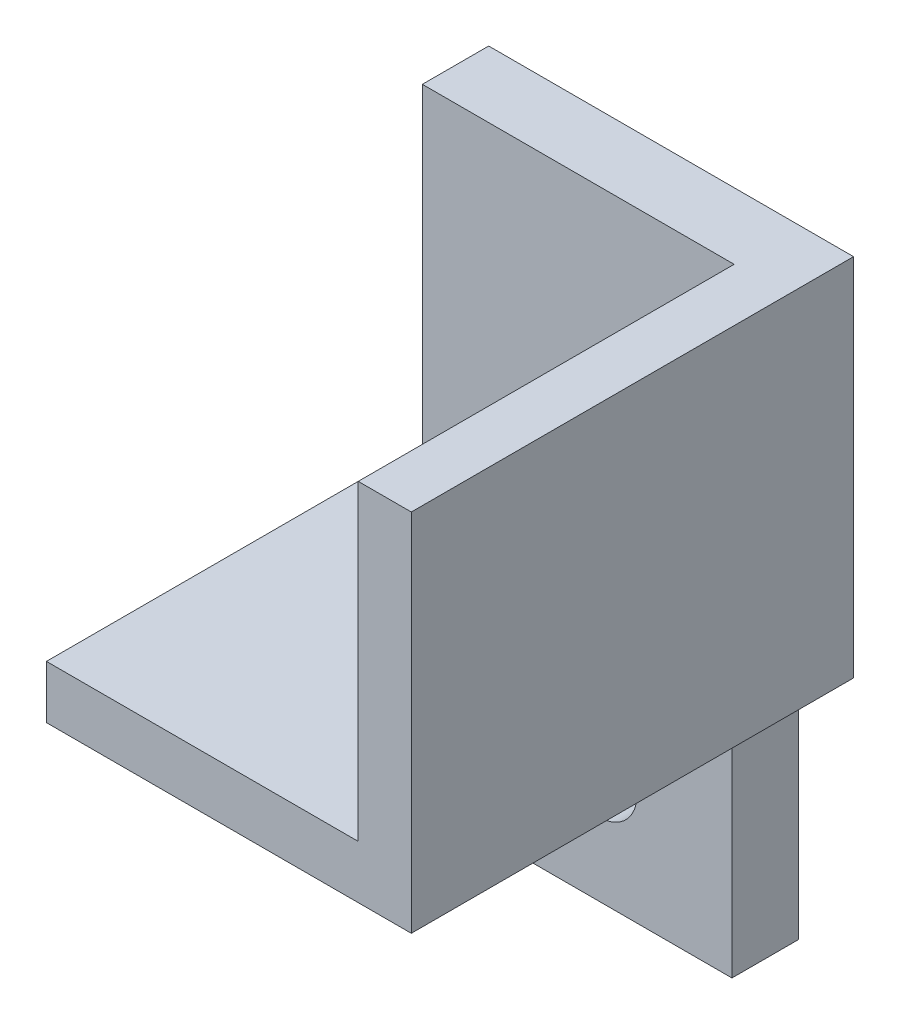
ISO-10303-21;
HEADER;
FILE_DESCRIPTION(('STEP AP214'),'2;1');
FILE_NAME('part.step','',(''),(''),'','','');
FILE_SCHEMA(('AUTOMOTIVE_DESIGN { 1 0 10303 214 1 1 1 1 }'));
ENDSEC;
DATA;
#1=APPLICATION_CONTEXT('core data for automotive mechanical design processes');
#2=APPLICATION_PROTOCOL_DEFINITION('international standard','automotive_design',2000,#1);
#3=PRODUCT_CONTEXT('',#1,'mechanical');
#4=PRODUCT('Part','Part','',(#3));
#5=PRODUCT_RELATED_PRODUCT_CATEGORY('part','',(#4));
#6=PRODUCT_DEFINITION_FORMATION('','',#4);
#7=PRODUCT_DEFINITION_CONTEXT('part definition',#1,'design');
#8=PRODUCT_DEFINITION('design','',#6,#7);
#9=PRODUCT_DEFINITION_SHAPE('','',#8);
#10=(LENGTH_UNIT() NAMED_UNIT(*) SI_UNIT(.MILLI.,.METRE.));
#11=(NAMED_UNIT(*) PLANE_ANGLE_UNIT() SI_UNIT($,.RADIAN.));
#12=(NAMED_UNIT(*) SI_UNIT($,.STERADIAN.) SOLID_ANGLE_UNIT());
#13=UNCERTAINTY_MEASURE_WITH_UNIT(LENGTH_MEASURE(1.E-05),#10,'distance_accuracy_value','');
#14=(GEOMETRIC_REPRESENTATION_CONTEXT(3) GLOBAL_UNCERTAINTY_ASSIGNED_CONTEXT((#13)) GLOBAL_UNIT_ASSIGNED_CONTEXT((#10,
#11,#12)) REPRESENTATION_CONTEXT('',''));
#15=CARTESIAN_POINT('',(0.,0.,0.));
#16=DIRECTION('',(0.,0.,1.));
#17=DIRECTION('',(1.,0.,0.));
#18=AXIS2_PLACEMENT_3D('',#15,#16,#17);
#19=CARTESIAN_POINT('',(-20.,-72.,181.4));
#20=DIRECTION('',(0.,0.,1.));
#21=DIRECTION('',(1.,0.,0.));
#22=AXIS2_PLACEMENT_3D('',#19,#20,#21);
#23=CYLINDRICAL_SURFACE('',#22,1.7);
#24=CARTESIAN_POINT('',(-20.,-72.,184.5));
#25=DIRECTION('',(0.,0.,-1.));
#26=DIRECTION('',(1.,0.,0.));
#27=AXIS2_PLACEMENT_3D('',#24,#25,#26);
#28=CIRCLE('',#27,1.7);
#29=CARTESIAN_POINT('',(-18.3,-72.,184.5));
#30=VERTEX_POINT('',#29);
#31=EDGE_CURVE('E172',#30,#30,#28,.T.);
#32=ORIENTED_EDGE('',*,*,#31,.F.);
#33=DIRECTION('',(0.,0.,1.));
#34=VECTOR('',#33,1.);
#35=CARTESIAN_POINT('',(-18.3,-72.,181.4));
#36=LINE('',#35,#34);
#37=CARTESIAN_POINT('',(-18.3,-72.,181.5));
#38=VERTEX_POINT('',#37);
#39=EDGE_CURVE('E10',#38,#30,#36,.T.);
#40=ORIENTED_EDGE('',*,*,#39,.F.);
#41=CARTESIAN_POINT('',(-20.,-72.,181.5));
#42=DIRECTION('',(0.,0.,-1.));
#43=DIRECTION('',(1.,0.,0.));
#44=AXIS2_PLACEMENT_3D('',#41,#42,#43);
#45=CIRCLE('',#44,1.7);
#46=EDGE_CURVE('E153',#38,#38,#45,.T.);
#47=ORIENTED_EDGE('',*,*,#46,.T.);
#48=ORIENTED_EDGE('',*,*,#39,.T.);
#49=EDGE_LOOP('',(#32,#40,#47,#48));
#50=FACE_BOUND('',#49,.T.);
#51=ADVANCED_FACE('F15',(#50),#23,.F.);
#52=CARTESIAN_POINT('',(-26.,-77.,181.5));
#53=DIRECTION('',(0.,-1.,0.));
#54=DIRECTION('',(0.,0.,-1.));
#55=AXIS2_PLACEMENT_3D('',#52,#53,#54);
#56=PLANE('',#55);
#57=DIRECTION('',(0.,0.,1.));
#58=VECTOR('',#57,1.);
#59=CARTESIAN_POINT('',(-14.,-77.,181.5));
#60=LINE('',#59,#58);
#61=CARTESIAN_POINT('',(-14.,-77.,181.5));
#62=VERTEX_POINT('',#61);
#63=CARTESIAN_POINT('',(-14.,-77.,184.5));
#64=VERTEX_POINT('',#63);
#65=EDGE_CURVE('E26',#62,#64,#60,.T.);
#66=ORIENTED_EDGE('',*,*,#65,.T.);
#67=DIRECTION('',(1.,0.,0.));
#68=VECTOR('',#67,1.);
#69=CARTESIAN_POINT('',(-26.,-77.,184.5));
#70=LINE('',#69,#68);
#71=CARTESIAN_POINT('',(-26.,-77.,184.5));
#72=VERTEX_POINT('',#71);
#73=EDGE_CURVE('E125',#72,#64,#70,.T.);
#74=ORIENTED_EDGE('',*,*,#73,.F.);
#75=DIRECTION('',(0.,0.,1.));
#76=VECTOR('',#75,1.);
#77=CARTESIAN_POINT('',(-26.,-77.,181.5));
#78=LINE('',#77,#76);
#79=CARTESIAN_POINT('',(-26.,-77.,181.5));
#80=VERTEX_POINT('',#79);
#81=EDGE_CURVE('E121',#80,#72,#78,.T.);
#82=ORIENTED_EDGE('',*,*,#81,.F.);
#83=DIRECTION('',(1.,0.,0.));
#84=VECTOR('',#83,1.);
#85=CARTESIAN_POINT('',(-26.,-77.,181.5));
#86=LINE('',#85,#84);
#87=EDGE_CURVE('E170',#80,#62,#86,.T.);
#88=ORIENTED_EDGE('',*,*,#87,.T.);
#89=EDGE_LOOP('',(#66,#74,#82,#88));
#90=FACE_BOUND('',#89,.T.);
#91=ADVANCED_FACE('F293',(#90),#56,.T.);
#92=CARTESIAN_POINT('',(-14.,-65.5,181.5));
#93=DIRECTION('',(1.,0.,0.));
#94=DIRECTION('',(0.,1.,0.));
#95=AXIS2_PLACEMENT_3D('',#92,#93,#94);
#96=PLANE('',#95);
#97=DIRECTION('',(0.,-1.,0.));
#98=VECTOR('',#97,1.);
#99=CARTESIAN_POINT('',(-14.,-65.5,184.5));
#100=LINE('',#99,#98);
#101=CARTESIAN_POINT('',(-14.,-65.5,184.5));
#102=VERTEX_POINT('',#101);
#103=EDGE_CURVE('E130',#102,#64,#100,.T.);
#104=ORIENTED_EDGE('',*,*,#103,.T.);
#105=ORIENTED_EDGE('',*,*,#65,.F.);
#106=DIRECTION('',(0.,-1.,0.));
#107=VECTOR('',#106,1.);
#108=CARTESIAN_POINT('',(-14.,-65.5,181.5));
#109=LINE('',#108,#107);
#110=CARTESIAN_POINT('',(-14.,-65.5,181.5));
#111=VERTEX_POINT('',#110);
#112=EDGE_CURVE('E166',#111,#62,#109,.T.);
#113=ORIENTED_EDGE('',*,*,#112,.F.);
#114=DIRECTION('',(0.,0.,1.));
#115=VECTOR('',#114,1.);
#116=CARTESIAN_POINT('',(-14.,-65.5,181.5));
#117=LINE('',#116,#115);
#118=EDGE_CURVE('E135',#111,#102,#117,.T.);
#119=ORIENTED_EDGE('',*,*,#118,.T.);
#120=EDGE_LOOP('',(#104,#105,#113,#119));
#121=FACE_BOUND('',#120,.T.);
#122=ADVANCED_FACE('F297',(#121),#96,.T.);
#123=CARTESIAN_POINT('',(-26.,-65.5,184.5));
#124=DIRECTION('',(0.,0.,1.));
#125=DIRECTION('',(1.,0.,0.));
#126=AXIS2_PLACEMENT_3D('',#123,#124,#125);
#127=PLANE('',#126);
#128=ORIENTED_EDGE('',*,*,#31,.T.);
#129=EDGE_LOOP('',(#128));
#130=FACE_BOUND('',#129,.T.);
#131=ORIENTED_EDGE('',*,*,#73,.T.);
#132=ORIENTED_EDGE('',*,*,#103,.F.);
#133=DIRECTION('',(1.,0.,0.));
#134=VECTOR('',#133,1.);
#135=CARTESIAN_POINT('',(-26.,-65.5,184.5));
#136=LINE('',#135,#134);
#137=CARTESIAN_POINT('',(-26.,-65.5,184.5));
#138=VERTEX_POINT('',#137);
#139=EDGE_CURVE('E127',#138,#102,#136,.T.);
#140=ORIENTED_EDGE('',*,*,#139,.F.);
#141=DIRECTION('',(0.,-1.,0.));
#142=VECTOR('',#141,1.);
#143=CARTESIAN_POINT('',(-26.,-65.5,184.5));
#144=LINE('',#143,#142);
#145=EDGE_CURVE('E19',#138,#72,#144,.T.);
#146=ORIENTED_EDGE('',*,*,#145,.T.);
#147=EDGE_LOOP('',(#131,#132,#140,#146));
#148=FACE_BOUND('',#147,.T.);
#149=ADVANCED_FACE('F128',(#130,#148),#127,.T.);
#150=CARTESIAN_POINT('',(-26.,-65.5,181.5));
#151=DIRECTION('',(1.,0.,0.));
#152=DIRECTION('',(0.,1.,0.));
#153=AXIS2_PLACEMENT_3D('',#150,#151,#152);
#154=PLANE('',#153);
#155=DIRECTION('',(0.,0.,1.));
#156=VECTOR('',#155,1.);
#157=CARTESIAN_POINT('',(-26.,-65.5,181.5));
#158=LINE('',#157,#156);
#159=CARTESIAN_POINT('',(-26.,-65.5,181.5));
#160=VERTEX_POINT('',#159);
#161=EDGE_CURVE('E119',#160,#138,#158,.T.);
#162=ORIENTED_EDGE('',*,*,#161,.F.);
#163=DIRECTION('',(0.,-1.,0.));
#164=VECTOR('',#163,1.);
#165=CARTESIAN_POINT('',(-26.,-65.5,181.5));
#166=LINE('',#165,#164);
#167=EDGE_CURVE('E212',#160,#80,#166,.T.);
#168=ORIENTED_EDGE('',*,*,#167,.T.);
#169=ORIENTED_EDGE('',*,*,#81,.T.);
#170=ORIENTED_EDGE('',*,*,#145,.F.);
#171=EDGE_LOOP('',(#162,#168,#169,#170));
#172=FACE_BOUND('',#171,.T.);
#173=ADVANCED_FACE('F116',(#172),#154,.F.);
#174=CARTESIAN_POINT('',(-13.9,-48.9,184.5));
#175=DIRECTION('',(1.,0.,0.));
#176=DIRECTION('',(0.,1.,0.));
#177=AXIS2_PLACEMENT_3D('',#174,#175,#176);
#178=PLANE('',#177);
#179=DIRECTION('',(0.,0.,-1.));
#180=VECTOR('',#179,1.);
#181=CARTESIAN_POINT('',(-13.9,-49.,183.));
#182=LINE('',#181,#180);
#183=CARTESIAN_POINT('',(-13.9,-49.,201.5));
#184=VERTEX_POINT('',#183);
#185=CARTESIAN_POINT('',(-13.9,-49.,184.5));
#186=VERTEX_POINT('',#185);
#187=EDGE_CURVE('E178',#184,#186,#182,.T.);
#188=ORIENTED_EDGE('',*,*,#187,.T.);
#189=DIRECTION('',(0.,-1.,0.));
#190=VECTOR('',#189,1.);
#191=CARTESIAN_POINT('',(-13.9,-48.9,184.5));
#192=LINE('',#191,#190);
#193=CARTESIAN_POINT('',(-13.9,-63.1,184.5));
#194=VERTEX_POINT('',#193);
#195=EDGE_CURVE('E165',#186,#194,#192,.T.);
#196=ORIENTED_EDGE('',*,*,#195,.T.);
#197=DIRECTION('',(0.,0.,1.));
#198=VECTOR('',#197,1.);
#199=CARTESIAN_POINT('',(-13.9,-63.1,184.5));
#200=LINE('',#199,#198);
#201=CARTESIAN_POINT('',(-13.9,-63.1,201.5));
#202=VERTEX_POINT('',#201);
#203=EDGE_CURVE('E195',#194,#202,#200,.T.);
#204=ORIENTED_EDGE('',*,*,#203,.T.);
#205=DIRECTION('',(0.,-1.,0.));
#206=VECTOR('',#205,1.);
#207=CARTESIAN_POINT('',(-13.9,-48.95,201.5));
#208=LINE('',#207,#206);
#209=EDGE_CURVE('E143',#184,#202,#208,.T.);
#210=ORIENTED_EDGE('',*,*,#209,.F.);
#211=EDGE_LOOP('',(#188,#196,#204,#210));
#212=FACE_BOUND('',#211,.T.);
#213=ADVANCED_FACE('F280',(#212),#178,.F.);
#214=CARTESIAN_POINT('',(-11.5,-49.,181.5));
#215=DIRECTION('',(1.,0.,0.));
#216=DIRECTION('',(0.,1.,0.));
#217=AXIS2_PLACEMENT_3D('',#214,#215,#216);
#218=PLANE('',#217);
#219=DIRECTION('',(0.,-1.,0.));
#220=VECTOR('',#219,1.);
#221=CARTESIAN_POINT('',(-11.5,-49.,201.5));
#222=LINE('',#221,#220);
#223=CARTESIAN_POINT('',(-11.5,-49.,201.5));
#224=VERTEX_POINT('',#223);
#225=CARTESIAN_POINT('',(-11.5,-65.5,201.5));
#226=VERTEX_POINT('',#225);
#227=EDGE_CURVE('E149',#224,#226,#222,.T.);
#228=ORIENTED_EDGE('',*,*,#227,.T.);
#229=DIRECTION('',(0.,0.,1.));
#230=VECTOR('',#229,1.);
#231=CARTESIAN_POINT('',(-11.5,-65.5,181.5));
#232=LINE('',#231,#230);
#233=CARTESIAN_POINT('',(-11.5,-65.5,181.5));
#234=VERTEX_POINT('',#233);
#235=EDGE_CURVE('E179',#234,#226,#232,.T.);
#236=ORIENTED_EDGE('',*,*,#235,.F.);
#237=DIRECTION('',(0.,-1.,0.));
#238=VECTOR('',#237,1.);
#239=CARTESIAN_POINT('',(-11.5,-49.,181.5));
#240=LINE('',#239,#238);
#241=CARTESIAN_POINT('',(-11.5,-49.,181.5));
#242=VERTEX_POINT('',#241);
#243=EDGE_CURVE('E171',#242,#234,#240,.T.);
#244=ORIENTED_EDGE('',*,*,#243,.F.);
#245=DIRECTION('',(0.,0.,1.));
#246=VECTOR('',#245,1.);
#247=CARTESIAN_POINT('',(-11.5,-49.,181.5));
#248=LINE('',#247,#246);
#249=EDGE_CURVE('E158',#242,#224,#248,.T.);
#250=ORIENTED_EDGE('',*,*,#249,.T.);
#251=EDGE_LOOP('',(#228,#236,#244,#250));
#252=FACE_BOUND('',#251,.T.);
#253=ADVANCED_FACE('F278',(#252),#218,.T.);
#254=CARTESIAN_POINT('',(-28.,-49.,181.5));
#255=DIRECTION('',(0.,0.,1.));
#256=DIRECTION('',(1.,0.,0.));
#257=AXIS2_PLACEMENT_3D('',#254,#255,#256);
#258=PLANE('',#257);
#259=ORIENTED_EDGE('',*,*,#46,.F.);
#260=EDGE_LOOP('',(#259));
#261=FACE_BOUND('',#260,.T.);
#262=DIRECTION('',(0.,-1.,0.));
#263=VECTOR('',#262,1.);
#264=CARTESIAN_POINT('',(-28.,-49.,181.5));
#265=LINE('',#264,#263);
#266=CARTESIAN_POINT('',(-28.,-49.,181.5));
#267=VERTEX_POINT('',#266);
#268=CARTESIAN_POINT('',(-28.,-65.5,181.5));
#269=VERTEX_POINT('',#268);
#270=EDGE_CURVE('E192',#267,#269,#265,.T.);
#271=ORIENTED_EDGE('',*,*,#270,.F.);
#272=DIRECTION('',(1.,0.,0.));
#273=VECTOR('',#272,1.);
#274=CARTESIAN_POINT('',(-28.,-49.,181.5));
#275=LINE('',#274,#273);
#276=EDGE_CURVE('E155',#267,#242,#275,.T.);
#277=ORIENTED_EDGE('',*,*,#276,.T.);
#278=ORIENTED_EDGE('',*,*,#243,.T.);
#279=DIRECTION('',(1.,0.,0.));
#280=VECTOR('',#279,1.);
#281=CARTESIAN_POINT('',(-28.,-65.5,181.5));
#282=LINE('',#281,#280);
#283=EDGE_CURVE('E181',#111,#234,#282,.T.);
#284=ORIENTED_EDGE('',*,*,#283,.F.);
#285=ORIENTED_EDGE('',*,*,#112,.T.);
#286=ORIENTED_EDGE('',*,*,#87,.F.);
#287=ORIENTED_EDGE('',*,*,#167,.F.);
#288=DIRECTION('',(1.,0.,0.));
#289=VECTOR('',#288,1.);
#290=CARTESIAN_POINT('',(-28.,-65.5,181.5));
#291=LINE('',#290,#289);
#292=EDGE_CURVE('E141',#269,#160,#291,.T.);
#293=ORIENTED_EDGE('',*,*,#292,.F.);
#294=EDGE_LOOP('',(#271,#277,#278,#284,#285,#286,#287,#293));
#295=FACE_BOUND('',#294,.T.);
#296=ADVANCED_FACE('F271',(#261,#295),#258,.F.);
#297=CARTESIAN_POINT('',(-28.,-65.5,181.5));
#298=DIRECTION('',(0.,-1.,0.));
#299=DIRECTION('',(0.,0.,-1.));
#300=AXIS2_PLACEMENT_3D('',#297,#298,#299);
#301=PLANE('',#300);
#302=ORIENTED_EDGE('',*,*,#161,.T.);
#303=ORIENTED_EDGE('',*,*,#139,.T.);
#304=ORIENTED_EDGE('',*,*,#118,.F.);
#305=ORIENTED_EDGE('',*,*,#283,.T.);
#306=ORIENTED_EDGE('',*,*,#235,.T.);
#307=DIRECTION('',(1.,0.,0.));
#308=VECTOR('',#307,1.);
#309=CARTESIAN_POINT('',(-28.,-65.5,201.5));
#310=LINE('',#309,#308);
#311=CARTESIAN_POINT('',(-28.,-65.5,201.5));
#312=VERTEX_POINT('',#311);
#313=EDGE_CURVE('E188',#312,#226,#310,.T.);
#314=ORIENTED_EDGE('',*,*,#313,.F.);
#315=DIRECTION('',(0.,0.,1.));
#316=VECTOR('',#315,1.);
#317=CARTESIAN_POINT('',(-28.,-65.5,181.5));
#318=LINE('',#317,#316);
#319=EDGE_CURVE('E255',#269,#312,#318,.T.);
#320=ORIENTED_EDGE('',*,*,#319,.F.);
#321=ORIENTED_EDGE('',*,*,#292,.T.);
#322=EDGE_LOOP('',(#302,#303,#304,#305,#306,#314,#320,#321));
#323=FACE_BOUND('',#322,.T.);
#324=ADVANCED_FACE('F138',(#323),#301,.T.);
#325=CARTESIAN_POINT('',(-28.,-49.,201.5));
#326=DIRECTION('',(0.,0.,1.));
#327=DIRECTION('',(1.,0.,0.));
#328=AXIS2_PLACEMENT_3D('',#325,#326,#327);
#329=PLANE('',#328);
#330=ORIENTED_EDGE('',*,*,#313,.T.);
#331=ORIENTED_EDGE('',*,*,#227,.F.);
#332=DIRECTION('',(1.,0.,0.));
#333=VECTOR('',#332,1.);
#334=CARTESIAN_POINT('',(-28.,-49.,201.5));
#335=LINE('',#334,#333);
#336=EDGE_CURVE('E225',#184,#224,#335,.T.);
#337=ORIENTED_EDGE('',*,*,#336,.F.);
#338=ORIENTED_EDGE('',*,*,#209,.T.);
#339=DIRECTION('',(-1.,0.,0.));
#340=VECTOR('',#339,1.);
#341=CARTESIAN_POINT('',(-28.05,-63.1,201.5));
#342=LINE('',#341,#340);
#343=CARTESIAN_POINT('',(-28.,-63.1,201.5));
#344=VERTEX_POINT('',#343);
#345=EDGE_CURVE('E164',#202,#344,#342,.T.);
#346=ORIENTED_EDGE('',*,*,#345,.T.);
#347=DIRECTION('',(0.,-1.,0.));
#348=VECTOR('',#347,1.);
#349=CARTESIAN_POINT('',(-28.,-49.,201.5));
#350=LINE('',#349,#348);
#351=EDGE_CURVE('E246',#344,#312,#350,.T.);
#352=ORIENTED_EDGE('',*,*,#351,.T.);
#353=EDGE_LOOP('',(#330,#331,#337,#338,#346,#352));
#354=FACE_BOUND('',#353,.T.);
#355=ADVANCED_FACE('F279',(#354),#329,.T.);
#356=CARTESIAN_POINT('',(-28.1,-63.1,184.5));
#357=DIRECTION('',(0.,-1.,0.));
#358=DIRECTION('',(0.,0.,-1.));
#359=AXIS2_PLACEMENT_3D('',#356,#357,#358);
#360=PLANE('',#359);
#361=DIRECTION('',(1.,0.,0.));
#362=VECTOR('',#361,1.);
#363=CARTESIAN_POINT('',(-28.1,-63.1,184.5));
#364=LINE('',#363,#362);
#365=CARTESIAN_POINT('',(-28.,-63.1,184.5));
#366=VERTEX_POINT('',#365);
#367=EDGE_CURVE('E160',#366,#194,#364,.T.);
#368=ORIENTED_EDGE('',*,*,#367,.F.);
#369=DIRECTION('',(0.,0.,1.));
#370=VECTOR('',#369,1.);
#371=CARTESIAN_POINT('',(-28.,-63.1,183.));
#372=LINE('',#371,#370);
#373=EDGE_CURVE('E243',#366,#344,#372,.T.);
#374=ORIENTED_EDGE('',*,*,#373,.T.);
#375=ORIENTED_EDGE('',*,*,#345,.F.);
#376=ORIENTED_EDGE('',*,*,#203,.F.);
#377=EDGE_LOOP('',(#368,#374,#375,#376));
#378=FACE_BOUND('',#377,.T.);
#379=ADVANCED_FACE('F301',(#378),#360,.F.);
#380=CARTESIAN_POINT('',(-28.1,-48.9,184.5));
#381=DIRECTION('',(0.,0.,1.));
#382=DIRECTION('',(1.,0.,0.));
#383=AXIS2_PLACEMENT_3D('',#380,#381,#382);
#384=PLANE('',#383);
#385=ORIENTED_EDGE('',*,*,#195,.F.);
#386=DIRECTION('',(1.,0.,0.));
#387=VECTOR('',#386,1.);
#388=CARTESIAN_POINT('',(-28.05,-49.,184.5));
#389=LINE('',#388,#387);
#390=CARTESIAN_POINT('',(-28.,-49.,184.5));
#391=VERTEX_POINT('',#390);
#392=EDGE_CURVE('E157',#391,#186,#389,.T.);
#393=ORIENTED_EDGE('',*,*,#392,.F.);
#394=DIRECTION('',(0.,1.,0.));
#395=VECTOR('',#394,1.);
#396=CARTESIAN_POINT('',(-28.,-48.95,184.5));
#397=LINE('',#396,#395);
#398=EDGE_CURVE('E245',#366,#391,#397,.T.);
#399=ORIENTED_EDGE('',*,*,#398,.F.);
#400=ORIENTED_EDGE('',*,*,#367,.T.);
#401=EDGE_LOOP('',(#385,#393,#399,#400));
#402=FACE_BOUND('',#401,.T.);
#403=ADVANCED_FACE('F303',(#402),#384,.T.);
#404=CARTESIAN_POINT('',(-28.,-49.,181.5));
#405=DIRECTION('',(0.,-1.,0.));
#406=DIRECTION('',(0.,0.,-1.));
#407=AXIS2_PLACEMENT_3D('',#404,#405,#406);
#408=PLANE('',#407);
#409=ORIENTED_EDGE('',*,*,#249,.F.);
#410=ORIENTED_EDGE('',*,*,#276,.F.);
#411=DIRECTION('',(0.,0.,1.));
#412=VECTOR('',#411,1.);
#413=CARTESIAN_POINT('',(-28.,-49.,181.5));
#414=LINE('',#413,#412);
#415=EDGE_CURVE('E189',#267,#391,#414,.T.);
#416=ORIENTED_EDGE('',*,*,#415,.T.);
#417=ORIENTED_EDGE('',*,*,#392,.T.);
#418=ORIENTED_EDGE('',*,*,#187,.F.);
#419=ORIENTED_EDGE('',*,*,#336,.T.);
#420=EDGE_LOOP('',(#409,#410,#416,#417,#418,#419));
#421=FACE_BOUND('',#420,.T.);
#422=ADVANCED_FACE('F17',(#421),#408,.F.);
#423=CARTESIAN_POINT('',(-28.,-49.,181.5));
#424=DIRECTION('',(1.,0.,0.));
#425=DIRECTION('',(0.,1.,0.));
#426=AXIS2_PLACEMENT_3D('',#423,#424,#425);
#427=PLANE('',#426);
#428=ORIENTED_EDGE('',*,*,#415,.F.);
#429=ORIENTED_EDGE('',*,*,#270,.T.);
#430=ORIENTED_EDGE('',*,*,#319,.T.);
#431=ORIENTED_EDGE('',*,*,#351,.F.);
#432=ORIENTED_EDGE('',*,*,#373,.F.);
#433=ORIENTED_EDGE('',*,*,#398,.T.);
#434=EDGE_LOOP('',(#428,#429,#430,#431,#432,#433));
#435=FACE_BOUND('',#434,.T.);
#436=ADVANCED_FACE('F268',(#435),#427,.F.);
#437=CLOSED_SHELL('',(#51,#91,#122,#149,#173,#213,#253,#296,#324,#355,#379,#403,#422,#436));
#438=MANIFOLD_SOLID_BREP('B1',#437);
#439=ADVANCED_BREP_SHAPE_REPRESENTATION('',(#18,#438),#14);
#440=SHAPE_DEFINITION_REPRESENTATION(#9,#439);
ENDSEC;
END-ISO-10303-21;
